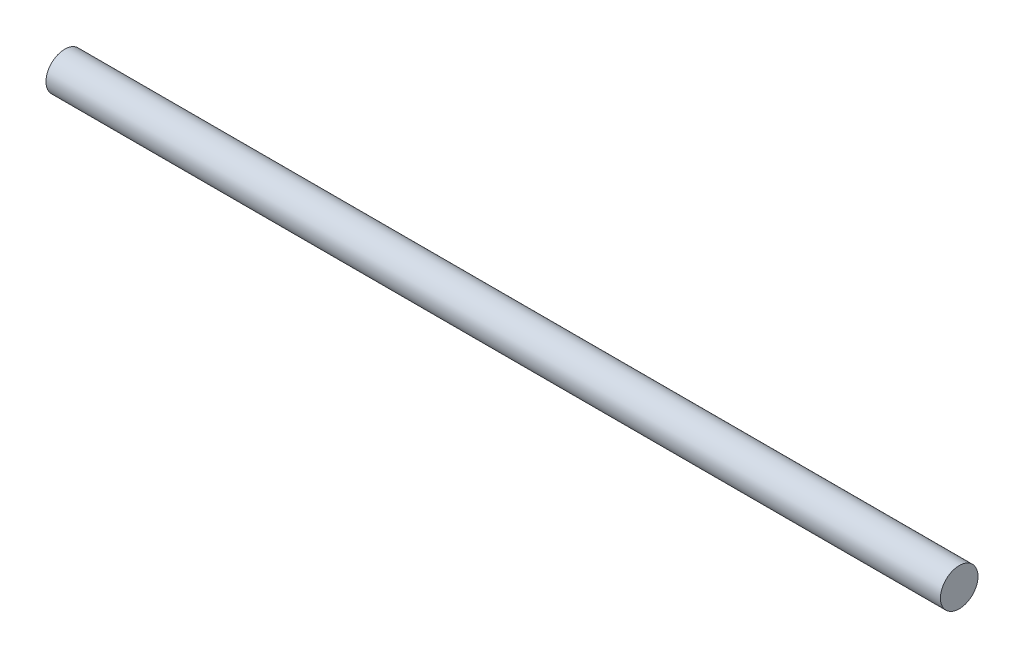
ISO-10303-21;
HEADER;
FILE_DESCRIPTION(('STEP AP214'),'2;1');
FILE_NAME('part.step','',(''),(''),'','','');
FILE_SCHEMA(('AUTOMOTIVE_DESIGN { 1 0 10303 214 1 1 1 1 }'));
ENDSEC;
DATA;
#1=APPLICATION_CONTEXT('core data for automotive mechanical design processes');
#2=APPLICATION_PROTOCOL_DEFINITION('international standard','automotive_design',2000,#1);
#3=PRODUCT_CONTEXT('',#1,'mechanical');
#4=PRODUCT('Part','Part','',(#3));
#5=PRODUCT_RELATED_PRODUCT_CATEGORY('part','',(#4));
#6=PRODUCT_DEFINITION_FORMATION('','',#4);
#7=PRODUCT_DEFINITION_CONTEXT('part definition',#1,'design');
#8=PRODUCT_DEFINITION('design','',#6,#7);
#9=PRODUCT_DEFINITION_SHAPE('','',#8);
#10=(LENGTH_UNIT() NAMED_UNIT(*) SI_UNIT(.MILLI.,.METRE.));
#11=(NAMED_UNIT(*) PLANE_ANGLE_UNIT() SI_UNIT($,.RADIAN.));
#12=(NAMED_UNIT(*) SI_UNIT($,.STERADIAN.) SOLID_ANGLE_UNIT());
#13=UNCERTAINTY_MEASURE_WITH_UNIT(LENGTH_MEASURE(1.E-05),#10,'distance_accuracy_value','');
#14=(GEOMETRIC_REPRESENTATION_CONTEXT(3) GLOBAL_UNCERTAINTY_ASSIGNED_CONTEXT((#13)) GLOBAL_UNIT_ASSIGNED_CONTEXT((#10,
#11,#12)) REPRESENTATION_CONTEXT('',''));
#15=CARTESIAN_POINT('',(0.,0.,0.));
#16=DIRECTION('',(0.,0.,1.));
#17=DIRECTION('',(1.,0.,0.));
#18=AXIS2_PLACEMENT_3D('',#15,#16,#17);
#19=CARTESIAN_POINT('',(100.,0.,0.));
#20=DIRECTION('',(-1.,0.,0.));
#21=DIRECTION('',(0.,0.,1.));
#22=AXIS2_PLACEMENT_3D('',#19,#20,#21);
#23=CYLINDRICAL_SURFACE('',#22,4.2);
#24=CARTESIAN_POINT('',(100.,0.,0.));
#25=DIRECTION('',(1.,0.,0.));
#26=DIRECTION('',(0.,0.,-1.));
#27=AXIS2_PLACEMENT_3D('',#24,#25,#26);
#28=CIRCLE('',#27,4.2);
#29=CARTESIAN_POINT('',(100.,0.,-4.2));
#30=VERTEX_POINT('',#29);
#31=EDGE_CURVE('E10',#30,#30,#28,.T.);
#32=ORIENTED_EDGE('',*,*,#31,.F.);
#33=EDGE_LOOP('',(#32));
#34=FACE_BOUND('',#33,.T.);
#35=CARTESIAN_POINT('',(-100.,0.,0.));
#36=DIRECTION('',(1.,0.,0.));
#37=DIRECTION('',(0.,0.,-1.));
#38=AXIS2_PLACEMENT_3D('',#35,#36,#37);
#39=CIRCLE('',#38,4.2);
#40=CARTESIAN_POINT('',(-100.,0.,-4.2));
#41=VERTEX_POINT('',#40);
#42=EDGE_CURVE('E38',#41,#41,#39,.T.);
#43=ORIENTED_EDGE('',*,*,#42,.T.);
#44=EDGE_LOOP('',(#43));
#45=FACE_BOUND('',#44,.T.);
#46=ADVANCED_FACE('F35',(#34,#45),#23,.T.);
#47=CARTESIAN_POINT('',(100.,0.,0.));
#48=DIRECTION('',(1.,0.,0.));
#49=DIRECTION('',(0.,0.,-1.));
#50=AXIS2_PLACEMENT_3D('',#47,#48,#49);
#51=PLANE('',#50);
#52=ORIENTED_EDGE('',*,*,#31,.T.);
#53=EDGE_LOOP('',(#52));
#54=FACE_BOUND('',#53,.T.);
#55=ADVANCED_FACE('F50',(#54),#51,.T.);
#56=CARTESIAN_POINT('',(-100.,0.,0.));
#57=DIRECTION('',(1.,0.,0.));
#58=DIRECTION('',(0.,0.,-1.));
#59=AXIS2_PLACEMENT_3D('',#56,#57,#58);
#60=PLANE('',#59);
#61=ORIENTED_EDGE('',*,*,#42,.F.);
#62=EDGE_LOOP('',(#61));
#63=FACE_BOUND('',#62,.T.);
#64=ADVANCED_FACE('F48',(#63),#60,.F.);
#65=CLOSED_SHELL('',(#46,#55,#64));
#66=MANIFOLD_SOLID_BREP('B2',#65);
#67=ADVANCED_BREP_SHAPE_REPRESENTATION('',(#18,#66),#14);
#68=SHAPE_DEFINITION_REPRESENTATION(#9,#67);
ENDSEC;
END-ISO-10303-21;
